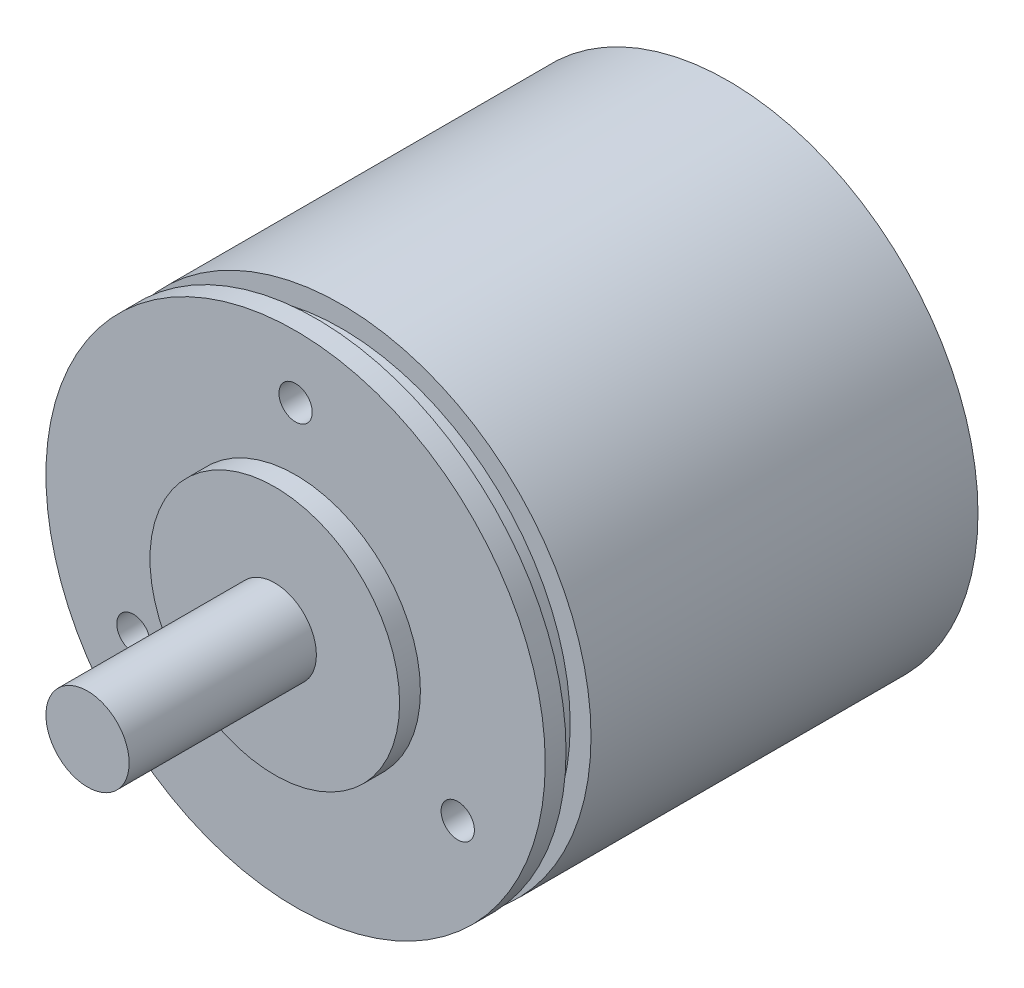
ISO-10303-21;
HEADER;
FILE_DESCRIPTION(('STEP AP214'),'2;1');
FILE_NAME('part.step','',(''),(''),'','','');
FILE_SCHEMA(('AUTOMOTIVE_DESIGN { 1 0 10303 214 1 1 1 1 }'));
ENDSEC;
DATA;
#1=APPLICATION_CONTEXT('core data for automotive mechanical design processes');
#2=APPLICATION_PROTOCOL_DEFINITION('international standard','automotive_design',2000,#1);
#3=PRODUCT_CONTEXT('',#1,'mechanical');
#4=PRODUCT('Part','Part','',(#3));
#5=PRODUCT_RELATED_PRODUCT_CATEGORY('part','',(#4));
#6=PRODUCT_DEFINITION_FORMATION('','',#4);
#7=PRODUCT_DEFINITION_CONTEXT('part definition',#1,'design');
#8=PRODUCT_DEFINITION('design','',#6,#7);
#9=PRODUCT_DEFINITION_SHAPE('','',#8);
#10=(LENGTH_UNIT() NAMED_UNIT(*) SI_UNIT(.MILLI.,.METRE.));
#11=(NAMED_UNIT(*) PLANE_ANGLE_UNIT() SI_UNIT($,.RADIAN.));
#12=(NAMED_UNIT(*) SI_UNIT($,.STERADIAN.) SOLID_ANGLE_UNIT());
#13=UNCERTAINTY_MEASURE_WITH_UNIT(LENGTH_MEASURE(1.E-05),#10,'distance_accuracy_value','');
#14=(GEOMETRIC_REPRESENTATION_CONTEXT(3) GLOBAL_UNCERTAINTY_ASSIGNED_CONTEXT((#13)) GLOBAL_UNIT_ASSIGNED_CONTEXT((#10,
#11,#12)) REPRESENTATION_CONTEXT('',''));
#15=CARTESIAN_POINT('',(0.,0.,0.));
#16=DIRECTION('',(0.,0.,1.));
#17=DIRECTION('',(1.,0.,0.));
#18=AXIS2_PLACEMENT_3D('',#15,#16,#17);
#19=CARTESIAN_POINT('',(0.,0.,9.));
#20=DIRECTION('',(0.,0.,-1.));
#21=DIRECTION('',(-1.,0.,0.));
#22=AXIS2_PLACEMENT_3D('',#19,#20,#21);
#23=PLANE('',#22);
#24=CARTESIAN_POINT('',(0.,0.,9.));
#25=DIRECTION('',(0.,0.,1.));
#26=DIRECTION('',(1.,0.,0.));
#27=AXIS2_PLACEMENT_3D('',#24,#25,#26);
#28=CIRCLE('',#27,2.);
#29=CARTESIAN_POINT('',(2.,0.,9.));
#30=VERTEX_POINT('',#29);
#31=EDGE_CURVE('E11',#30,#30,#28,.T.);
#32=ORIENTED_EDGE('',*,*,#31,.T.);
#33=EDGE_LOOP('',(#32));
#34=FACE_BOUND('',#33,.T.);
#35=ADVANCED_FACE('F36',(#34),#23,.F.);
#36=CARTESIAN_POINT('',(0.,0.,27.8338956367243));
#37=DIRECTION('',(0.,0.,1.));
#38=DIRECTION('',(1.,0.,0.));
#39=AXIS2_PLACEMENT_3D('',#36,#37,#38);
#40=CYLINDRICAL_SURFACE('',#39,2.);
#41=ORIENTED_EDGE('',*,*,#31,.F.);
#42=EDGE_LOOP('',(#41));
#43=FACE_BOUND('',#42,.T.);
#44=CARTESIAN_POINT('',(0.,0.,0.));
#45=DIRECTION('',(0.,0.,1.));
#46=DIRECTION('',(1.,0.,0.));
#47=AXIS2_PLACEMENT_3D('',#44,#45,#46);
#48=CIRCLE('',#47,2.);
#49=CARTESIAN_POINT('',(2.,0.,0.));
#50=VERTEX_POINT('',#49);
#51=EDGE_CURVE('E44',#50,#50,#48,.T.);
#52=ORIENTED_EDGE('',*,*,#51,.T.);
#53=EDGE_LOOP('',(#52));
#54=FACE_BOUND('',#53,.T.);
#55=ADVANCED_FACE('F123',(#43,#54),#40,.T.);
#56=CARTESIAN_POINT('',(0.,2.,0.));
#57=DIRECTION('',(0.,0.,-1.));
#58=DIRECTION('',(-1.,0.,0.));
#59=AXIS2_PLACEMENT_3D('',#56,#57,#58);
#60=PLANE('',#59);
#61=ORIENTED_EDGE('',*,*,#51,.F.);
#62=EDGE_LOOP('',(#61));
#63=FACE_BOUND('',#62,.T.);
#64=CARTESIAN_POINT('',(0.,0.,0.));
#65=DIRECTION('',(0.,0.,1.));
#66=DIRECTION('',(1.,0.,0.));
#67=AXIS2_PLACEMENT_3D('',#64,#65,#66);
#68=CIRCLE('',#67,6.);
#69=CARTESIAN_POINT('',(6.,0.,0.));
#70=VERTEX_POINT('',#69);
#71=EDGE_CURVE('E96',#70,#70,#68,.T.);
#72=ORIENTED_EDGE('',*,*,#71,.T.);
#73=EDGE_LOOP('',(#72));
#74=FACE_BOUND('',#73,.T.);
#75=ADVANCED_FACE('F128',(#63,#74),#60,.F.);
#76=CARTESIAN_POINT('',(0.,0.,27.8338956367243));
#77=DIRECTION('',(0.,0.,1.));
#78=DIRECTION('',(1.,0.,0.));
#79=AXIS2_PLACEMENT_3D('',#76,#77,#78);
#80=CYLINDRICAL_SURFACE('',#79,6.);
#81=ORIENTED_EDGE('',*,*,#71,.F.);
#82=EDGE_LOOP('',(#81));
#83=FACE_BOUND('',#82,.T.);
#84=CARTESIAN_POINT('',(0.,0.,-1.));
#85=DIRECTION('',(0.,0.,1.));
#86=DIRECTION('',(1.,0.,0.));
#87=AXIS2_PLACEMENT_3D('',#84,#85,#86);
#88=CIRCLE('',#87,6.);
#89=CARTESIAN_POINT('',(6.,0.,-1.));
#90=VERTEX_POINT('',#89);
#91=EDGE_CURVE('E93',#90,#90,#88,.T.);
#92=ORIENTED_EDGE('',*,*,#91,.T.);
#93=EDGE_LOOP('',(#92));
#94=FACE_BOUND('',#93,.T.);
#95=ADVANCED_FACE('F136',(#83,#94),#80,.T.);
#96=CARTESIAN_POINT('',(0.,6.,-1.));
#97=DIRECTION('',(0.,0.,-1.));
#98=DIRECTION('',(-1.,0.,0.));
#99=AXIS2_PLACEMENT_3D('',#96,#97,#98);
#100=PLANE('',#99);
#101=CARTESIAN_POINT('',(-7.79422863405993,-4.50000000000004,-1.));
#102=DIRECTION('',(0.,0.,-1.));
#103=DIRECTION('',(-1.,0.,0.));
#104=AXIS2_PLACEMENT_3D('',#101,#102,#103);
#105=CIRCLE('',#104,0.799999999999999);
#106=CARTESIAN_POINT('',(-8.59422863405993,-4.50000000000004,-1.));
#107=VERTEX_POINT('',#106);
#108=EDGE_CURVE('E39',#107,#107,#105,.T.);
#109=ORIENTED_EDGE('',*,*,#108,.T.);
#110=EDGE_LOOP('',(#109));
#111=FACE_BOUND('',#110,.T.);
#112=CARTESIAN_POINT('',(7.79422863405993,-4.50000000000004,-1.));
#113=DIRECTION('',(0.,0.,-1.));
#114=DIRECTION('',(-1.,0.,0.));
#115=AXIS2_PLACEMENT_3D('',#112,#113,#114);
#116=CIRCLE('',#115,0.799999999999999);
#117=CARTESIAN_POINT('',(6.99422863405993,-4.50000000000004,-1.));
#118=VERTEX_POINT('',#117);
#119=EDGE_CURVE('E70',#118,#118,#116,.T.);
#120=ORIENTED_EDGE('',*,*,#119,.T.);
#121=EDGE_LOOP('',(#120));
#122=FACE_BOUND('',#121,.T.);
#123=CARTESIAN_POINT('',(0.,9.,-1.));
#124=DIRECTION('',(0.,0.,-1.));
#125=DIRECTION('',(-1.,0.,0.));
#126=AXIS2_PLACEMENT_3D('',#123,#124,#125);
#127=CIRCLE('',#126,0.799999999999999);
#128=CARTESIAN_POINT('',(-0.799999999999999,9.,-1.));
#129=VERTEX_POINT('',#128);
#130=EDGE_CURVE('E74',#129,#129,#127,.T.);
#131=ORIENTED_EDGE('',*,*,#130,.T.);
#132=EDGE_LOOP('',(#131));
#133=FACE_BOUND('',#132,.T.);
#134=ORIENTED_EDGE('',*,*,#91,.F.);
#135=EDGE_LOOP('',(#134));
#136=FACE_BOUND('',#135,.T.);
#137=CARTESIAN_POINT('',(0.,0.,-1.));
#138=DIRECTION('',(0.,0.,1.));
#139=DIRECTION('',(1.,0.,0.));
#140=AXIS2_PLACEMENT_3D('',#137,#138,#139);
#141=CIRCLE('',#140,12.);
#142=CARTESIAN_POINT('',(12.,0.,-1.));
#143=VERTEX_POINT('',#142);
#144=EDGE_CURVE('E90',#143,#143,#141,.T.);
#145=ORIENTED_EDGE('',*,*,#144,.T.);
#146=EDGE_LOOP('',(#145));
#147=FACE_BOUND('',#146,.T.);
#148=ADVANCED_FACE('F105',(#111,#122,#133,#136,#147),#100,.F.);
#149=CARTESIAN_POINT('',(0.,0.,27.8338956367243));
#150=DIRECTION('',(0.,0.,1.));
#151=DIRECTION('',(1.,0.,0.));
#152=AXIS2_PLACEMENT_3D('',#149,#150,#151);
#153=CYLINDRICAL_SURFACE('',#152,12.);
#154=ORIENTED_EDGE('',*,*,#144,.F.);
#155=EDGE_LOOP('',(#154));
#156=FACE_BOUND('',#155,.T.);
#157=CARTESIAN_POINT('',(0.,0.,-2.));
#158=DIRECTION('',(0.,0.,1.));
#159=DIRECTION('',(1.,0.,0.));
#160=AXIS2_PLACEMENT_3D('',#157,#158,#159);
#161=CIRCLE('',#160,12.);
#162=CARTESIAN_POINT('',(12.,0.,-2.));
#163=VERTEX_POINT('',#162);
#164=EDGE_CURVE('E87',#163,#163,#161,.T.);
#165=ORIENTED_EDGE('',*,*,#164,.T.);
#166=EDGE_LOOP('',(#165));
#167=FACE_BOUND('',#166,.T.);
#168=ADVANCED_FACE('F147',(#156,#167),#153,.T.);
#169=CARTESIAN_POINT('',(0.,12.,-2.));
#170=DIRECTION('',(0.,0.,1.));
#171=DIRECTION('',(1.,0.,0.));
#172=AXIS2_PLACEMENT_3D('',#169,#170,#171);
#173=PLANE('',#172);
#174=ORIENTED_EDGE('',*,*,#164,.F.);
#175=EDGE_LOOP('',(#174));
#176=FACE_BOUND('',#175,.T.);
#177=CARTESIAN_POINT('',(0.,0.,-2.));
#178=DIRECTION('',(0.,0.,1.));
#179=DIRECTION('',(1.,0.,0.));
#180=AXIS2_PLACEMENT_3D('',#177,#178,#179);
#181=CIRCLE('',#180,11.);
#182=CARTESIAN_POINT('',(11.,0.,-2.));
#183=VERTEX_POINT('',#182);
#184=EDGE_CURVE('E84',#183,#183,#181,.T.);
#185=ORIENTED_EDGE('',*,*,#184,.T.);
#186=EDGE_LOOP('',(#185));
#187=FACE_BOUND('',#186,.T.);
#188=ADVANCED_FACE('F154',(#176,#187),#173,.F.);
#189=CARTESIAN_POINT('',(0.,0.,27.8338956367243));
#190=DIRECTION('',(0.,0.,1.));
#191=DIRECTION('',(1.,0.,0.));
#192=AXIS2_PLACEMENT_3D('',#189,#190,#191);
#193=CYLINDRICAL_SURFACE('',#192,11.);
#194=ORIENTED_EDGE('',*,*,#184,.F.);
#195=EDGE_LOOP('',(#194));
#196=FACE_BOUND('',#195,.T.);
#197=CARTESIAN_POINT('',(0.,0.,-3.2));
#198=DIRECTION('',(0.,0.,1.));
#199=DIRECTION('',(1.,0.,0.));
#200=AXIS2_PLACEMENT_3D('',#197,#198,#199);
#201=CIRCLE('',#200,11.);
#202=CARTESIAN_POINT('',(11.,0.,-3.2));
#203=VERTEX_POINT('',#202);
#204=EDGE_CURVE('E81',#203,#203,#201,.T.);
#205=ORIENTED_EDGE('',*,*,#204,.T.);
#206=EDGE_LOOP('',(#205));
#207=FACE_BOUND('',#206,.T.);
#208=ADVANCED_FACE('F160',(#196,#207),#193,.T.);
#209=CARTESIAN_POINT('',(0.,11.,-3.2));
#210=DIRECTION('',(0.,0.,-1.));
#211=DIRECTION('',(-1.,0.,0.));
#212=AXIS2_PLACEMENT_3D('',#209,#210,#211);
#213=PLANE('',#212);
#214=ORIENTED_EDGE('',*,*,#204,.F.);
#215=EDGE_LOOP('',(#214));
#216=FACE_BOUND('',#215,.T.);
#217=CARTESIAN_POINT('',(0.,0.,-3.2));
#218=DIRECTION('',(0.,0.,1.));
#219=DIRECTION('',(1.,0.,0.));
#220=AXIS2_PLACEMENT_3D('',#217,#218,#219);
#221=CIRCLE('',#220,12.);
#222=CARTESIAN_POINT('',(12.,0.,-3.2));
#223=VERTEX_POINT('',#222);
#224=EDGE_CURVE('E78',#223,#223,#221,.T.);
#225=ORIENTED_EDGE('',*,*,#224,.T.);
#226=EDGE_LOOP('',(#225));
#227=FACE_BOUND('',#226,.T.);
#228=ADVANCED_FACE('F166',(#216,#227),#213,.F.);
#229=CARTESIAN_POINT('',(0.,0.,27.8338956367243));
#230=DIRECTION('',(0.,0.,1.));
#231=DIRECTION('',(1.,0.,0.));
#232=AXIS2_PLACEMENT_3D('',#229,#230,#231);
#233=CYLINDRICAL_SURFACE('',#232,12.);
#234=ORIENTED_EDGE('',*,*,#224,.F.);
#235=EDGE_LOOP('',(#234));
#236=FACE_BOUND('',#235,.T.);
#237=CARTESIAN_POINT('',(0.,0.,-21.8));
#238=DIRECTION('',(0.,0.,1.));
#239=DIRECTION('',(1.,0.,0.));
#240=AXIS2_PLACEMENT_3D('',#237,#238,#239);
#241=CIRCLE('',#240,12.);
#242=CARTESIAN_POINT('',(12.,0.,-21.8));
#243=VERTEX_POINT('',#242);
#244=EDGE_CURVE('E75',#243,#243,#241,.T.);
#245=ORIENTED_EDGE('',*,*,#244,.T.);
#246=EDGE_LOOP('',(#245));
#247=FACE_BOUND('',#246,.T.);
#248=ADVANCED_FACE('F172',(#236,#247),#233,.T.);
#249=CARTESIAN_POINT('',(0.,12.,-21.8));
#250=DIRECTION('',(0.,0.,1.));
#251=DIRECTION('',(1.,0.,0.));
#252=AXIS2_PLACEMENT_3D('',#249,#250,#251);
#253=PLANE('',#252);
#254=ORIENTED_EDGE('',*,*,#244,.F.);
#255=EDGE_LOOP('',(#254));
#256=FACE_BOUND('',#255,.T.);
#257=ADVANCED_FACE('F178',(#256),#253,.F.);
#258=CARTESIAN_POINT('',(0.,9.,0.));
#259=DIRECTION('',(0.,0.,1.));
#260=DIRECTION('',(1.,0.,0.));
#261=AXIS2_PLACEMENT_3D('',#258,#259,#260);
#262=CYLINDRICAL_SURFACE('',#261,0.799999999999999);
#263=CARTESIAN_POINT('',(0.,9.,-3.2));
#264=DIRECTION('',(0.,0.,1.));
#265=DIRECTION('',(1.,0.,0.));
#266=AXIS2_PLACEMENT_3D('',#263,#264,#265);
#267=CIRCLE('',#266,0.799999999999999);
#268=CARTESIAN_POINT('',(0.799999999999999,9.,-3.2));
#269=VERTEX_POINT('',#268);
#270=EDGE_CURVE('E71',#269,#269,#267,.T.);
#271=ORIENTED_EDGE('',*,*,#270,.F.);
#272=EDGE_LOOP('',(#271));
#273=FACE_BOUND('',#272,.T.);
#274=ORIENTED_EDGE('',*,*,#130,.F.);
#275=EDGE_LOOP('',(#274));
#276=FACE_BOUND('',#275,.T.);
#277=ADVANCED_FACE('F119',(#273,#276),#262,.F.);
#278=CARTESIAN_POINT('',(0.,9.,-3.2));
#279=DIRECTION('',(0.,0.,1.));
#280=DIRECTION('',(1.,0.,0.));
#281=AXIS2_PLACEMENT_3D('',#278,#279,#280);
#282=CONICAL_SURFACE('',#281,0.799999999999999,1.02974425867665);
#283=CARTESIAN_POINT('',(0.,9.,-3.68068849522205));
#284=VERTEX_POINT('',#283);
#285=VERTEX_LOOP('',#284);
#286=FACE_BOUND('',#285,.T.);
#287=ORIENTED_EDGE('',*,*,#270,.T.);
#288=EDGE_LOOP('',(#287));
#289=FACE_BOUND('',#288,.T.);
#290=ADVANCED_FACE('F111',(#286,#289),#282,.F.);
#291=CARTESIAN_POINT('',(7.79422863405993,-4.50000000000004,0.));
#292=DIRECTION('',(0.,0.,1.));
#293=DIRECTION('',(1.,0.,0.));
#294=AXIS2_PLACEMENT_3D('',#291,#292,#293);
#295=CYLINDRICAL_SURFACE('',#294,0.799999999999999);
#296=CARTESIAN_POINT('',(7.79422863405993,-4.50000000000004,-3.2));
#297=DIRECTION('',(0.,0.,1.));
#298=DIRECTION('',(1.,0.,0.));
#299=AXIS2_PLACEMENT_3D('',#296,#297,#298);
#300=CIRCLE('',#299,0.799999999999999);
#301=CARTESIAN_POINT('',(8.59422863405993,-4.50000000000004,-3.2));
#302=VERTEX_POINT('',#301);
#303=EDGE_CURVE('E66',#302,#302,#300,.T.);
#304=ORIENTED_EDGE('',*,*,#303,.F.);
#305=EDGE_LOOP('',(#304));
#306=FACE_BOUND('',#305,.T.);
#307=ORIENTED_EDGE('',*,*,#119,.F.);
#308=EDGE_LOOP('',(#307));
#309=FACE_BOUND('',#308,.T.);
#310=ADVANCED_FACE('F108',(#306,#309),#295,.F.);
#311=CARTESIAN_POINT('',(7.79422863405993,-4.50000000000004,-3.2));
#312=DIRECTION('',(0.,0.,1.));
#313=DIRECTION('',(1.,0.,0.));
#314=AXIS2_PLACEMENT_3D('',#311,#312,#313);
#315=CONICAL_SURFACE('',#314,0.799999999999999,1.02974425867665);
#316=CARTESIAN_POINT('',(7.79422863405992,-4.50000000000004,-3.68068849522205));
#317=VERTEX_POINT('',#316);
#318=VERTEX_LOOP('',#317);
#319=FACE_BOUND('',#318,.T.);
#320=ORIENTED_EDGE('',*,*,#303,.T.);
#321=EDGE_LOOP('',(#320));
#322=FACE_BOUND('',#321,.T.);
#323=ADVANCED_FACE('F110',(#319,#322),#315,.F.);
#324=CARTESIAN_POINT('',(-7.79422863405993,-4.50000000000004,0.));
#325=DIRECTION('',(0.,0.,1.));
#326=DIRECTION('',(1.,0.,0.));
#327=AXIS2_PLACEMENT_3D('',#324,#325,#326);
#328=CYLINDRICAL_SURFACE('',#327,0.799999999999999);
#329=CARTESIAN_POINT('',(-7.79422863405993,-4.50000000000004,-3.2));
#330=DIRECTION('',(0.,0.,1.));
#331=DIRECTION('',(1.,0.,0.));
#332=AXIS2_PLACEMENT_3D('',#329,#330,#331);
#333=CIRCLE('',#332,0.799999999999999);
#334=CARTESIAN_POINT('',(-6.99422863405993,-4.50000000000004,-3.2));
#335=VERTEX_POINT('',#334);
#336=EDGE_CURVE('E62',#335,#335,#333,.T.);
#337=ORIENTED_EDGE('',*,*,#336,.F.);
#338=EDGE_LOOP('',(#337));
#339=FACE_BOUND('',#338,.T.);
#340=ORIENTED_EDGE('',*,*,#108,.F.);
#341=EDGE_LOOP('',(#340));
#342=FACE_BOUND('',#341,.T.);
#343=ADVANCED_FACE('F58',(#339,#342),#328,.F.);
#344=CARTESIAN_POINT('',(-7.79422863405993,-4.50000000000004,-3.2));
#345=DIRECTION('',(0.,0.,1.));
#346=DIRECTION('',(1.,0.,0.));
#347=AXIS2_PLACEMENT_3D('',#344,#345,#346);
#348=CONICAL_SURFACE('',#347,0.799999999999999,1.02974425867665);
#349=CARTESIAN_POINT('',(-7.79422863405993,-4.50000000000004,-3.68068849522205));
#350=VERTEX_POINT('',#349);
#351=VERTEX_LOOP('',#350);
#352=FACE_BOUND('',#351,.T.);
#353=ORIENTED_EDGE('',*,*,#336,.T.);
#354=EDGE_LOOP('',(#353));
#355=FACE_BOUND('',#354,.T.);
#356=ADVANCED_FACE('F55',(#352,#355),#348,.F.);
#357=CLOSED_SHELL('',(#35,#55,#75,#95,#148,#168,#188,#208,#228,#248,#257,#277,#290,#310,#323,
#343,#356));
#358=MANIFOLD_SOLID_BREP('B2',#357);
#359=ADVANCED_BREP_SHAPE_REPRESENTATION('',(#18,#358),#14);
#360=SHAPE_DEFINITION_REPRESENTATION(#9,#359);
ENDSEC;
END-ISO-10303-21;
